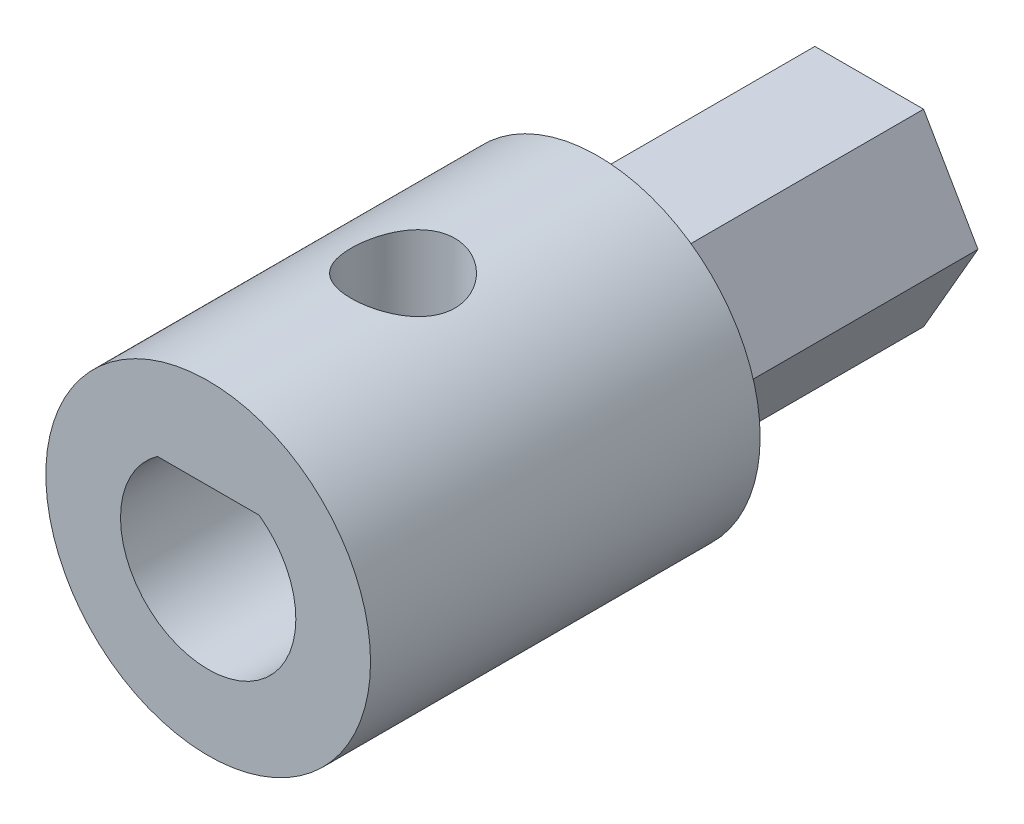
ISO-10303-21;
HEADER;
FILE_DESCRIPTION(('STEP AP214'),'2;1');
FILE_NAME('part.step','',(''),(''),'','','');
FILE_SCHEMA(('AUTOMOTIVE_DESIGN { 1 0 10303 214 1 1 1 1 }'));
ENDSEC;
DATA;
#1=APPLICATION_CONTEXT('core data for automotive mechanical design processes');
#2=APPLICATION_PROTOCOL_DEFINITION('international standard','automotive_design',2000,#1);
#3=PRODUCT_CONTEXT('',#1,'mechanical');
#4=PRODUCT('Part','Part','',(#3));
#5=PRODUCT_RELATED_PRODUCT_CATEGORY('part','',(#4));
#6=PRODUCT_DEFINITION_FORMATION('','',#4);
#7=PRODUCT_DEFINITION_CONTEXT('part definition',#1,'design');
#8=PRODUCT_DEFINITION('design','',#6,#7);
#9=PRODUCT_DEFINITION_SHAPE('','',#8);
#10=(LENGTH_UNIT() NAMED_UNIT(*) SI_UNIT(.MILLI.,.METRE.));
#11=(NAMED_UNIT(*) PLANE_ANGLE_UNIT() SI_UNIT($,.RADIAN.));
#12=(NAMED_UNIT(*) SI_UNIT($,.STERADIAN.) SOLID_ANGLE_UNIT());
#13=UNCERTAINTY_MEASURE_WITH_UNIT(LENGTH_MEASURE(1.E-05),#10,'distance_accuracy_value','');
#14=(GEOMETRIC_REPRESENTATION_CONTEXT(3) GLOBAL_UNCERTAINTY_ASSIGNED_CONTEXT((#13)) GLOBAL_UNIT_ASSIGNED_CONTEXT((#10,
#11,#12)) REPRESENTATION_CONTEXT('',''));
#15=CARTESIAN_POINT('',(0.,0.,0.));
#16=DIRECTION('',(0.,0.,1.));
#17=DIRECTION('',(1.,0.,0.));
#18=AXIS2_PLACEMENT_3D('',#15,#16,#17);
#19=CARTESIAN_POINT('',(-1.56524758424985,2.2,0.));
#20=DIRECTION('',(0.,1.,0.));
#21=DIRECTION('',(0.,0.,1.));
#22=AXIS2_PLACEMENT_3D('',#19,#20,#21);
#23=PLANE('',#22);
#24=DIRECTION('',(0.,0.,1.));
#25=VECTOR('',#24,1.);
#26=CARTESIAN_POINT('',(1.56524758424985,2.2,0.));
#27=LINE('',#26,#25);
#28=CARTESIAN_POINT('',(1.56524758424985,2.2,0.));
#29=VERTEX_POINT('',#28);
#30=CARTESIAN_POINT('',(1.56524758424985,2.2,14.0283375209644));
#31=VERTEX_POINT('',#30);
#32=EDGE_CURVE('E93',#29,#31,#27,.T.);
#33=ORIENTED_EDGE('',*,*,#32,.T.);
#34=CARTESIAN_POINT('',(0.,2.2,14.36));
#35=DIRECTION('',(0.,1.,0.));
#36=DIRECTION('',(0.,0.,1.));
#37=AXIS2_PLACEMENT_3D('',#34,#35,#36);
#38=CIRCLE('',#37,1.6);
#39=CARTESIAN_POINT('',(-1.56524758424985,2.2,14.0283375209645));
#40=VERTEX_POINT('',#39);
#41=EDGE_CURVE('E11',#31,#40,#38,.T.);
#42=ORIENTED_EDGE('',*,*,#41,.T.);
#43=DIRECTION('',(0.,0.,1.));
#44=VECTOR('',#43,1.);
#45=CARTESIAN_POINT('',(-1.56524758424985,2.2,0.));
#46=LINE('',#45,#44);
#47=CARTESIAN_POINT('',(-1.56524758424985,2.2,0.));
#48=VERTEX_POINT('',#47);
#49=EDGE_CURVE('E217',#48,#40,#46,.T.);
#50=ORIENTED_EDGE('',*,*,#49,.F.);
#51=DIRECTION('',(-1.,0.,0.));
#52=VECTOR('',#51,1.);
#53=CARTESIAN_POINT('',(-1.56524758424985,2.2,0.));
#54=LINE('',#53,#52);
#55=EDGE_CURVE('E209',#29,#48,#54,.T.);
#56=ORIENTED_EDGE('',*,*,#55,.F.);
#57=EDGE_LOOP('',(#33,#42,#50,#56));
#58=FACE_BOUND('',#57,.T.);
#59=ADVANCED_FACE('F45',(#58),#23,.F.);
#60=CARTESIAN_POINT('',(1.675,2.90118510267787,8.36));
#61=DIRECTION('',(0.,-1.,0.));
#62=DIRECTION('',(1.,0.,0.));
#63=AXIS2_PLACEMENT_3D('',#60,#61,#62);
#64=PLANE('',#63);
#65=DIRECTION('',(-1.,0.,0.));
#66=VECTOR('',#65,1.);
#67=CARTESIAN_POINT('',(1.675,2.90118510267787,0.));
#68=LINE('',#67,#66);
#69=CARTESIAN_POINT('',(1.675,2.90118510267787,0.));
#70=VERTEX_POINT('',#69);
#71=CARTESIAN_POINT('',(-1.675,2.90118510267787,0.));
#72=VERTEX_POINT('',#71);
#73=EDGE_CURVE('E149',#70,#72,#68,.T.);
#74=ORIENTED_EDGE('',*,*,#73,.T.);
#75=DIRECTION('',(0.,0.,-1.));
#76=VECTOR('',#75,1.);
#77=CARTESIAN_POINT('',(-1.675,2.90118510267787,8.36));
#78=LINE('',#77,#76);
#79=CARTESIAN_POINT('',(-1.675,2.90118510267787,8.36));
#80=VERTEX_POINT('',#79);
#81=EDGE_CURVE('E191',#80,#72,#78,.T.);
#82=ORIENTED_EDGE('',*,*,#81,.F.);
#83=DIRECTION('',(-1.,0.,0.));
#84=VECTOR('',#83,1.);
#85=CARTESIAN_POINT('',(1.675,2.90118510267787,8.36));
#86=LINE('',#85,#84);
#87=CARTESIAN_POINT('',(1.675,2.90118510267787,8.36));
#88=VERTEX_POINT('',#87);
#89=EDGE_CURVE('E144',#88,#80,#86,.T.);
#90=ORIENTED_EDGE('',*,*,#89,.F.);
#91=DIRECTION('',(0.,0.,-1.));
#92=VECTOR('',#91,1.);
#93=CARTESIAN_POINT('',(1.675,2.90118510267787,8.36));
#94=LINE('',#93,#92);
#95=EDGE_CURVE('E138',#88,#70,#94,.T.);
#96=ORIENTED_EDGE('',*,*,#95,.T.);
#97=EDGE_LOOP('',(#74,#82,#90,#96));
#98=FACE_BOUND('',#97,.T.);
#99=ADVANCED_FACE('F47',(#98),#64,.F.);
#100=CARTESIAN_POINT('',(-1.675,2.90118510267787,8.36));
#101=DIRECTION('',(0.866025403784439,-0.5,0.));
#102=DIRECTION('',(0.5,0.866025403784439,0.));
#103=AXIS2_PLACEMENT_3D('',#100,#101,#102);
#104=PLANE('',#103);
#105=DIRECTION('',(-0.5,-0.866025403784439,0.));
#106=VECTOR('',#105,1.);
#107=CARTESIAN_POINT('',(-1.675,2.90118510267787,0.));
#108=LINE('',#107,#106);
#109=CARTESIAN_POINT('',(-3.35,0.,0.));
#110=VERTEX_POINT('',#109);
#111=EDGE_CURVE('E156',#72,#110,#108,.T.);
#112=ORIENTED_EDGE('',*,*,#111,.T.);
#113=DIRECTION('',(0.,0.,-1.));
#114=VECTOR('',#113,1.);
#115=CARTESIAN_POINT('',(-3.35,0.,8.36));
#116=LINE('',#115,#114);
#117=CARTESIAN_POINT('',(-3.35,0.,8.36));
#118=VERTEX_POINT('',#117);
#119=EDGE_CURVE('E187',#118,#110,#116,.T.);
#120=ORIENTED_EDGE('',*,*,#119,.F.);
#121=DIRECTION('',(-0.5,-0.866025403784439,0.));
#122=VECTOR('',#121,1.);
#123=CARTESIAN_POINT('',(-1.675,2.90118510267787,8.36));
#124=LINE('',#123,#122);
#125=EDGE_CURVE('E225',#80,#118,#124,.T.);
#126=ORIENTED_EDGE('',*,*,#125,.F.);
#127=ORIENTED_EDGE('',*,*,#81,.T.);
#128=EDGE_LOOP('',(#112,#120,#126,#127));
#129=FACE_BOUND('',#128,.T.);
#130=ADVANCED_FACE('F245',(#129),#104,.F.);
#131=CARTESIAN_POINT('',(-3.35,0.,8.36));
#132=DIRECTION('',(0.866025403784439,0.5,0.));
#133=DIRECTION('',(-0.5,0.866025403784439,0.));
#134=AXIS2_PLACEMENT_3D('',#131,#132,#133);
#135=PLANE('',#134);
#136=DIRECTION('',(0.5,-0.866025403784439,0.));
#137=VECTOR('',#136,1.);
#138=CARTESIAN_POINT('',(-3.35,0.,0.));
#139=LINE('',#138,#137);
#140=CARTESIAN_POINT('',(-1.675,-2.90118510267787,0.));
#141=VERTEX_POINT('',#140);
#142=EDGE_CURVE('E163',#110,#141,#139,.T.);
#143=ORIENTED_EDGE('',*,*,#142,.T.);
#144=DIRECTION('',(0.,0.,-1.));
#145=VECTOR('',#144,1.);
#146=CARTESIAN_POINT('',(-1.675,-2.90118510267787,8.36));
#147=LINE('',#146,#145);
#148=CARTESIAN_POINT('',(-1.675,-2.90118510267787,8.36));
#149=VERTEX_POINT('',#148);
#150=EDGE_CURVE('E183',#149,#141,#147,.T.);
#151=ORIENTED_EDGE('',*,*,#150,.F.);
#152=DIRECTION('',(0.5,-0.866025403784439,0.));
#153=VECTOR('',#152,1.);
#154=CARTESIAN_POINT('',(-3.35,0.,8.36));
#155=LINE('',#154,#153);
#156=EDGE_CURVE('E229',#118,#149,#155,.T.);
#157=ORIENTED_EDGE('',*,*,#156,.F.);
#158=ORIENTED_EDGE('',*,*,#119,.T.);
#159=EDGE_LOOP('',(#143,#151,#157,#158));
#160=FACE_BOUND('',#159,.T.);
#161=ADVANCED_FACE('F247',(#160),#135,.F.);
#162=CARTESIAN_POINT('',(-1.675,-2.90118510267787,8.36));
#163=DIRECTION('',(0.,1.,0.));
#164=DIRECTION('',(-1.,0.,0.));
#165=AXIS2_PLACEMENT_3D('',#162,#163,#164);
#166=PLANE('',#165);
#167=DIRECTION('',(1.,0.,0.));
#168=VECTOR('',#167,1.);
#169=CARTESIAN_POINT('',(-1.675,-2.90118510267787,0.));
#170=LINE('',#169,#168);
#171=CARTESIAN_POINT('',(1.675,-2.90118510267787,0.));
#172=VERTEX_POINT('',#171);
#173=EDGE_CURVE('E173',#141,#172,#170,.T.);
#174=ORIENTED_EDGE('',*,*,#173,.T.);
#175=DIRECTION('',(0.,0.,-1.));
#176=VECTOR('',#175,1.);
#177=CARTESIAN_POINT('',(1.675,-2.90118510267787,8.36));
#178=LINE('',#177,#176);
#179=CARTESIAN_POINT('',(1.675,-2.90118510267787,8.36));
#180=VERTEX_POINT('',#179);
#181=EDGE_CURVE('E180',#180,#172,#178,.T.);
#182=ORIENTED_EDGE('',*,*,#181,.F.);
#183=DIRECTION('',(1.,0.,0.));
#184=VECTOR('',#183,1.);
#185=CARTESIAN_POINT('',(-1.675,-2.90118510267787,8.36));
#186=LINE('',#185,#184);
#187=EDGE_CURVE('E233',#149,#180,#186,.T.);
#188=ORIENTED_EDGE('',*,*,#187,.F.);
#189=ORIENTED_EDGE('',*,*,#150,.T.);
#190=EDGE_LOOP('',(#174,#182,#188,#189));
#191=FACE_BOUND('',#190,.T.);
#192=ADVANCED_FACE('F251',(#191),#166,.F.);
#193=CARTESIAN_POINT('',(1.675,-2.90118510267787,8.36));
#194=DIRECTION('',(-0.866025403784439,0.5,0.));
#195=DIRECTION('',(-0.5,-0.866025403784439,0.));
#196=AXIS2_PLACEMENT_3D('',#193,#194,#195);
#197=PLANE('',#196);
#198=DIRECTION('',(0.5,0.866025403784439,0.));
#199=VECTOR('',#198,1.);
#200=CARTESIAN_POINT('',(1.675,-2.90118510267787,0.));
#201=LINE('',#200,#199);
#202=CARTESIAN_POINT('',(3.35,0.,0.));
#203=VERTEX_POINT('',#202);
#204=EDGE_CURVE('E128',#172,#203,#201,.T.);
#205=ORIENTED_EDGE('',*,*,#204,.T.);
#206=DIRECTION('',(0.,0.,-1.));
#207=VECTOR('',#206,1.);
#208=CARTESIAN_POINT('',(3.35,0.,8.36));
#209=LINE('',#208,#207);
#210=CARTESIAN_POINT('',(3.35,0.,8.36));
#211=VERTEX_POINT('',#210);
#212=EDGE_CURVE('E140',#211,#203,#209,.T.);
#213=ORIENTED_EDGE('',*,*,#212,.F.);
#214=DIRECTION('',(0.5,0.866025403784439,0.));
#215=VECTOR('',#214,1.);
#216=CARTESIAN_POINT('',(1.675,-2.90118510267787,8.36));
#217=LINE('',#216,#215);
#218=EDGE_CURVE('E236',#180,#211,#217,.T.);
#219=ORIENTED_EDGE('',*,*,#218,.F.);
#220=ORIENTED_EDGE('',*,*,#181,.T.);
#221=EDGE_LOOP('',(#205,#213,#219,#220));
#222=FACE_BOUND('',#221,.T.);
#223=ADVANCED_FACE('F252',(#222),#197,.F.);
#224=CARTESIAN_POINT('',(3.35,0.,8.36));
#225=DIRECTION('',(-0.866025403784439,-0.5,0.));
#226=DIRECTION('',(0.5,-0.866025403784439,0.));
#227=AXIS2_PLACEMENT_3D('',#224,#225,#226);
#228=PLANE('',#227);
#229=DIRECTION('',(-0.5,0.866025403784439,0.));
#230=VECTOR('',#229,1.);
#231=CARTESIAN_POINT('',(3.35,0.,0.));
#232=LINE('',#231,#230);
#233=EDGE_CURVE('E134',#203,#70,#232,.T.);
#234=ORIENTED_EDGE('',*,*,#233,.T.);
#235=ORIENTED_EDGE('',*,*,#95,.F.);
#236=DIRECTION('',(-0.5,0.866025403784439,0.));
#237=VECTOR('',#236,1.);
#238=CARTESIAN_POINT('',(3.35,0.,8.36));
#239=LINE('',#238,#237);
#240=EDGE_CURVE('E152',#211,#88,#239,.T.);
#241=ORIENTED_EDGE('',*,*,#240,.F.);
#242=ORIENTED_EDGE('',*,*,#212,.T.);
#243=EDGE_LOOP('',(#234,#235,#241,#242));
#244=FACE_BOUND('',#243,.T.);
#245=ADVANCED_FACE('F136',(#244),#228,.F.);
#246=CARTESIAN_POINT('',(0.,0.,0.));
#247=DIRECTION('',(0.,0.,1.));
#248=DIRECTION('',(1.,0.,0.));
#249=AXIS2_PLACEMENT_3D('',#246,#247,#248);
#250=PLANE('',#249);
#251=ORIENTED_EDGE('',*,*,#55,.T.);
#252=CARTESIAN_POINT('',(0.,0.,0.));
#253=DIRECTION('',(0.,0.,1.));
#254=DIRECTION('',(1.,0.,0.));
#255=AXIS2_PLACEMENT_3D('',#252,#253,#254);
#256=CIRCLE('',#255,2.7);
#257=EDGE_CURVE('E70',#48,#29,#256,.T.);
#258=ORIENTED_EDGE('',*,*,#257,.T.);
#259=EDGE_LOOP('',(#251,#258));
#260=FACE_BOUND('',#259,.T.);
#261=ORIENTED_EDGE('',*,*,#73,.F.);
#262=ORIENTED_EDGE('',*,*,#233,.F.);
#263=ORIENTED_EDGE('',*,*,#204,.F.);
#264=ORIENTED_EDGE('',*,*,#173,.F.);
#265=ORIENTED_EDGE('',*,*,#142,.F.);
#266=ORIENTED_EDGE('',*,*,#111,.F.);
#267=EDGE_LOOP('',(#261,#262,#263,#264,#265,#266));
#268=FACE_BOUND('',#267,.T.);
#269=ADVANCED_FACE('F154',(#260,#268),#250,.F.);
#270=CARTESIAN_POINT('',(0.,0.,8.36));
#271=DIRECTION('',(0.,0.,1.));
#272=DIRECTION('',(1.,0.,0.));
#273=AXIS2_PLACEMENT_3D('',#270,#271,#272);
#274=PLANE('',#273);
#275=CARTESIAN_POINT('',(0.,0.,8.36));
#276=DIRECTION('',(0.,0.,1.));
#277=DIRECTION('',(1.,0.,0.));
#278=AXIS2_PLACEMENT_3D('',#275,#276,#277);
#279=CIRCLE('',#278,5.);
#280=CARTESIAN_POINT('',(5.,0.,8.36));
#281=VERTEX_POINT('',#280);
#282=EDGE_CURVE('E166',#281,#281,#279,.T.);
#283=ORIENTED_EDGE('',*,*,#282,.F.);
#284=EDGE_LOOP('',(#283));
#285=FACE_BOUND('',#284,.T.);
#286=ORIENTED_EDGE('',*,*,#240,.T.);
#287=ORIENTED_EDGE('',*,*,#89,.T.);
#288=ORIENTED_EDGE('',*,*,#125,.T.);
#289=ORIENTED_EDGE('',*,*,#156,.T.);
#290=ORIENTED_EDGE('',*,*,#187,.T.);
#291=ORIENTED_EDGE('',*,*,#218,.T.);
#292=EDGE_LOOP('',(#286,#287,#288,#289,#290,#291));
#293=FACE_BOUND('',#292,.T.);
#294=ADVANCED_FACE('F242',(#285,#293),#274,.F.);
#295=CARTESIAN_POINT('',(0.,0.,20.36));
#296=DIRECTION('',(0.,0.,-1.));
#297=DIRECTION('',(-1.,0.,0.));
#298=AXIS2_PLACEMENT_3D('',#295,#296,#297);
#299=CYLINDRICAL_SURFACE('',#298,5.);
#300=CARTESIAN_POINT('',(0.,-5.,15.96));
#301=CARTESIAN_POINT('',(0.0874958063159804,-4.99999978543627,15.9599997563494));
#302=CARTESIAN_POINT('',(0.174994637059061,-4.99768184156355,15.9527994047207));
#303=CARTESIAN_POINT('',(0.347426901237483,-4.98866262172227,15.9242681804707));
#304=CARTESIAN_POINT('',(0.432359863373709,-4.98196054553558,15.9029347281821));
#305=CARTESIAN_POINT('',(0.597149225791565,-4.9649038363541,15.8469350787882));
#306=CARTESIAN_POINT('',(0.677013473384595,-4.95455502045191,15.8122901076294));
#307=CARTESIAN_POINT('',(0.829798762851157,-4.93126901642872,15.7307431699127));
#308=CARTESIAN_POINT('',(0.902718607024947,-4.91833138300386,15.6838390942344));
#309=CARTESIAN_POINT('',(1.04189475779498,-4.89077067933825,15.577515886496));
#310=CARTESIAN_POINT('',(1.1078960922464,-4.87610957732918,15.5177729010466));
#311=CARTESIAN_POINT('',(1.22913423693228,-4.8469706570307,15.3881569334526));
#312=CARTESIAN_POINT('',(1.28436891793797,-4.83249287552328,15.3182819523451));
#313=CARTESIAN_POINT('',(1.38391395073831,-4.8049481079903,15.1681471454896));
#314=CARTESIAN_POINT('',(1.42790123109944,-4.79192785635417,15.0876637187295));
#315=CARTESIAN_POINT('',(1.5016091713459,-4.76934657798646,14.9199576562299));
#316=CARTESIAN_POINT('',(1.53133379773327,-4.75978458968016,14.8327369020117));
#317=CARTESIAN_POINT('',(1.57473134311321,-4.74560122760597,14.6569173927271));
#318=CARTESIAN_POINT('',(1.58887896846386,-4.74083414932744,14.568447898248));
#319=CARTESIAN_POINT('',(1.60220433058851,-4.73634831045,14.3902724008155));
#320=CARTESIAN_POINT('',(1.6013862709372,-4.73662813227306,14.300566752148));
#321=CARTESIAN_POINT('',(1.58517380736381,-4.74207619100075,14.1264344151118));
#322=CARTESIAN_POINT('',(1.57038842132725,-4.7470401743042,14.0419435465553));
#323=CARTESIAN_POINT('',(1.52765058974139,-4.76096457446162,13.8767111555779));
#324=CARTESIAN_POINT('',(1.49969668269327,-4.76992543490025,13.7959700504148));
#325=CARTESIAN_POINT('',(1.43099645158812,-4.7909865416364,13.6391021411743));
#326=CARTESIAN_POINT('',(1.39006273103723,-4.80313229469362,13.5630637800485));
#327=CARTESIAN_POINT('',(1.29669494334068,-4.82917444861168,13.4187379569732));
#328=CARTESIAN_POINT('',(1.24425776827155,-4.8430713221454,13.3504525972565));
#329=CARTESIAN_POINT('',(1.12640551540387,-4.87186372141871,13.2201353271337));
#330=CARTESIAN_POINT('',(1.06048936249403,-4.8867752080818,13.1585592230612));
#331=CARTESIAN_POINT('',(0.919081432217152,-4.91533168114877,13.0472213217663));
#332=CARTESIAN_POINT('',(0.843588875652697,-4.92897656433707,12.9974604868571));
#333=CARTESIAN_POINT('',(0.684261580712375,-4.95361789744584,12.9108365567198));
#334=CARTESIAN_POINT('',(0.600361279440636,-4.96459080547942,12.8740868991636));
#335=CARTESIAN_POINT('',(0.427135850361132,-4.98248161100196,12.8153604033373));
#336=CARTESIAN_POINT('',(0.337812463131549,-4.98940080204637,12.7933788521833));
#337=CARTESIAN_POINT('',(0.16014178958932,-4.99819424239135,12.7655999333348));
#338=CARTESIAN_POINT('',(0.0719002860170755,-5.00026060178154,12.7591859263889));
#339=CARTESIAN_POINT('',(-0.104410269588104,-4.99968655318444,12.7609792182213));
#340=CARTESIAN_POINT('',(-0.192479346087438,-4.99704687004206,12.7691842653099));
#341=CARTESIAN_POINT('',(-0.363535018203811,-4.98748380317497,12.7994901130812));
#342=CARTESIAN_POINT('',(-0.446594362478022,-4.98067486649266,12.8212199100859));
#343=CARTESIAN_POINT('',(-0.607861654600582,-4.96357585995349,12.8775017993962));
#344=CARTESIAN_POINT('',(-0.686068993794124,-4.95328535439547,12.9120554966022));
#345=CARTESIAN_POINT('',(-0.837596923870445,-4.92995531019905,12.9939710171781));
#346=CARTESIAN_POINT('',(-0.910745620500966,-4.9168532627009,13.0416325119423));
#347=CARTESIAN_POINT('',(-1.04821150300662,-4.8893940824048,13.1480538729856));
#348=CARTESIAN_POINT('',(-1.11252617555398,-4.87503659432078,13.2068168864583));
#349=CARTESIAN_POINT('',(-1.23328321488635,-4.84592967283237,13.336674159611));
#350=CARTESIAN_POINT('',(-1.2892857947562,-4.83118884166735,13.4081802676885));
#351=CARTESIAN_POINT('',(-1.38854141992569,-4.80360443110145,13.5598946744582));
#352=CARTESIAN_POINT('',(-1.43179457025642,-4.79076083607138,13.640102901454));
#353=CARTESIAN_POINT('',(-1.50407580301231,-4.76856262886575,13.8068435786561));
#354=CARTESIAN_POINT('',(-1.53315066307446,-4.75919656820051,13.8933541349897));
#355=CARTESIAN_POINT('',(-1.57620668246201,-4.74511281699328,14.0704072098103));
#356=CARTESIAN_POINT('',(-1.59019395006567,-4.74039324536734,14.160948081136));
#357=CARTESIAN_POINT('',(-1.60222535311566,-4.73633927898768,14.338875969164));
#358=CARTESIAN_POINT('',(-1.60099388446006,-4.73676019091382,14.426209011329));
#359=CARTESIAN_POINT('',(-1.5843835514937,-4.74234159093745,14.5993570054347));
#360=CARTESIAN_POINT('',(-1.56900540861121,-4.74750183734632,14.685172034561));
#361=CARTESIAN_POINT('',(-1.52503332416461,-4.76180543144416,14.8514834253769));
#362=CARTESIAN_POINT('',(-1.49665627942706,-4.77088327236763,14.9320431988929));
#363=CARTESIAN_POINT('',(-1.42766427484382,-4.79197975594362,15.0873217604008));
#364=CARTESIAN_POINT('',(-1.38704674114626,-4.8039990169992,15.1620393157627));
#365=CARTESIAN_POINT('',(-1.29279266707432,-4.83023494368376,15.3068096298144));
#366=CARTESIAN_POINT('',(-1.23869308431578,-4.8445211905268,15.376548262734));
#367=CARTESIAN_POINT('',(-1.11981399792884,-4.87337180847353,15.506191745821));
#368=CARTESIAN_POINT('',(-1.05503158166823,-4.88793625446696,15.5660939051986));
#369=CARTESIAN_POINT('',(-0.913912210298352,-4.91631108200117,15.6764582859238));
#370=CARTESIAN_POINT('',(-0.837251351760781,-4.93007751880386,15.7265189518843));
#371=CARTESIAN_POINT('',(-0.676163529926937,-4.95473787697861,15.8129801880972));
#372=CARTESIAN_POINT('',(-0.591739263208157,-4.96563279071293,15.8493854793208));
#373=CARTESIAN_POINT('',(-0.423663431644845,-4.98268341064065,15.9052477798304));
#374=CARTESIAN_POINT('',(-0.34037676648733,-4.98911901301451,15.9257184505831));
#375=CARTESIAN_POINT('',(-0.171394001076119,-4.99777693541394,15.953093142904));
#376=CARTESIAN_POINT('',(-0.0856984512613945,-5.00000021015613,15.9600002386455));
#377=CARTESIAN_POINT('',(0.,-5.,15.96));
#378=B_SPLINE_CURVE_WITH_KNOTS('',3,(#300,#301,#302,#303,#304,#305,#306,#307,#308,#309,#310,
#311,#312,#313,#314,#315,#316,#317,#318,#319,#320,#321,#322,#323,#324,#325,#326,#327,#328,#329,
#330,#331,#332,#333,#334,#335,#336,#337,#338,#339,#340,#341,#342,#343,#344,#345,#346,#347,#348,
#349,#350,#351,#352,#353,#354,#355,#356,#357,#358,#359,#360,#361,#362,#363,#364,#365,#366,#367,
#368,#369,#370,#371,#372,#373,#374,#375,#376,#377),.UNSPECIFIED.,.T.,.F.,(4,2,2,2,2,2,2,2,2,2,2,
2,2,2,2,2,2,2,2,2,2,2,2,2,2,2,2,2,2,2,2,2,2,2,2,2,2,2,4),(0.,0.262172289866487,
0.524392446348364,0.786196202111712,1.04804502964703,1.31749718151567,1.58700256668426,
1.86354828826627,2.14001705671955,2.40780489999506,2.67551752794224,2.93207089351446,
3.18865273918778,3.44912195934763,3.70966163813009,3.98267284808623,4.25570628624555,
4.53106471334195,4.80633522466349,5.07051010591344,5.33464430132699,5.59183416387789,
5.84905622438333,6.11273355055082,6.37648573964819,6.6512299305306,6.92597185797942,
7.19980110675105,7.47351945288796,7.73426134972847,7.99498995042988,8.25151822881316,
8.50810048600705,8.77513756675923,9.04224757485584,9.3186628553126,9.5949824844973,
9.85182740305348,10.1086141011962),.UNSPECIFIED.);
#379=CARTESIAN_POINT('',(0.,-5.,15.96));
#380=VERTEX_POINT('',#379);
#381=EDGE_CURVE('E323',#380,#380,#378,.T.);
#382=ORIENTED_EDGE('',*,*,#381,.T.);
#383=EDGE_LOOP('',(#382));
#384=FACE_BOUND('',#383,.T.);
#385=CARTESIAN_POINT('',(0.,5.,15.96));
#386=CARTESIAN_POINT('',(-0.0874958063159797,4.99999978543627,15.9599997563494));
#387=CARTESIAN_POINT('',(-0.174994637059061,4.99768184156355,15.9527994047207));
#388=CARTESIAN_POINT('',(-0.347426901237483,4.98866262172227,15.9242681804707));
#389=CARTESIAN_POINT('',(-0.432359863373708,4.98196054553558,15.9029347281821));
#390=CARTESIAN_POINT('',(-0.597149225791565,4.9649038363541,15.8469350787882));
#391=CARTESIAN_POINT('',(-0.677013473384594,4.95455502045191,15.8122901076294));
#392=CARTESIAN_POINT('',(-0.829798762851156,4.93126901642872,15.7307431699127));
#393=CARTESIAN_POINT('',(-0.902718607024946,4.91833138300386,15.6838390942344));
#394=CARTESIAN_POINT('',(-1.04189475779498,4.89077067933825,15.577515886496));
#395=CARTESIAN_POINT('',(-1.1078960922464,4.87610957732918,15.5177729010466));
#396=CARTESIAN_POINT('',(-1.22913423693228,4.8469706570307,15.3881569334526));
#397=CARTESIAN_POINT('',(-1.28436891793797,4.83249287552328,15.3182819523451));
#398=CARTESIAN_POINT('',(-1.38391395073831,4.8049481079903,15.1681471454896));
#399=CARTESIAN_POINT('',(-1.42790123109944,4.79192785635417,15.0876637187295));
#400=CARTESIAN_POINT('',(-1.5016091713459,4.76934657798646,14.9199576562299));
#401=CARTESIAN_POINT('',(-1.53133379773326,4.75978458968016,14.8327369020117));
#402=CARTESIAN_POINT('',(-1.57473134311321,4.74560122760597,14.6569173927271));
#403=CARTESIAN_POINT('',(-1.58887896846385,4.74083414932744,14.568447898248));
#404=CARTESIAN_POINT('',(-1.60220433058851,4.73634831045,14.3902724008155));
#405=CARTESIAN_POINT('',(-1.6013862709372,4.73662813227306,14.300566752148));
#406=CARTESIAN_POINT('',(-1.58517380736381,4.74207619100075,14.1264344151118));
#407=CARTESIAN_POINT('',(-1.57038842132725,4.7470401743042,14.0419435465553));
#408=CARTESIAN_POINT('',(-1.52765058974139,4.76096457446162,13.8767111555779));
#409=CARTESIAN_POINT('',(-1.49969668269327,4.76992543490025,13.7959700504148));
#410=CARTESIAN_POINT('',(-1.43099645158812,4.7909865416364,13.6391021411743));
#411=CARTESIAN_POINT('',(-1.39006273103722,4.80313229469363,13.5630637800485));
#412=CARTESIAN_POINT('',(-1.29669494334068,4.82917444861168,13.4187379569732));
#413=CARTESIAN_POINT('',(-1.24425776827155,4.8430713221454,13.3504525972565));
#414=CARTESIAN_POINT('',(-1.12640551540387,4.87186372141871,13.2201353271337));
#415=CARTESIAN_POINT('',(-1.06048936249402,4.8867752080818,13.1585592230612));
#416=CARTESIAN_POINT('',(-0.919081432217149,4.91533168114877,13.0472213217664));
#417=CARTESIAN_POINT('',(-0.843588875652695,4.92897656433707,12.9974604868571));
#418=CARTESIAN_POINT('',(-0.684261580712374,4.95361789744584,12.9108365567198));
#419=CARTESIAN_POINT('',(-0.600361279440635,4.96459080547942,12.8740868991636));
#420=CARTESIAN_POINT('',(-0.42713585036113,4.98248161100196,12.8153604033373));
#421=CARTESIAN_POINT('',(-0.337812463131548,4.98940080204637,12.7933788521833));
#422=CARTESIAN_POINT('',(-0.160141789589318,4.99819424239135,12.7655999333348));
#423=CARTESIAN_POINT('',(-0.0719002860170741,5.00026060178154,12.7591859263889));
#424=CARTESIAN_POINT('',(0.104410269588106,4.99968655318444,12.7609792182213));
#425=CARTESIAN_POINT('',(0.19247934608744,4.99704687004206,12.7691842653099));
#426=CARTESIAN_POINT('',(0.363535018203812,4.98748380317497,12.7994901130812));
#427=CARTESIAN_POINT('',(0.446594362478023,4.98067486649266,12.8212199100859));
#428=CARTESIAN_POINT('',(0.607861654600583,4.96357585995349,12.8775017993962));
#429=CARTESIAN_POINT('',(0.686068993794125,4.95328535439547,12.9120554966022));
#430=CARTESIAN_POINT('',(0.837596923870446,4.92995531019905,12.9939710171781));
#431=CARTESIAN_POINT('',(0.910745620500968,4.9168532627009,13.0416325119423));
#432=CARTESIAN_POINT('',(1.04821150300662,4.8893940824048,13.1480538729856));
#433=CARTESIAN_POINT('',(1.11252617555398,4.87503659432078,13.2068168864583));
#434=CARTESIAN_POINT('',(1.23328321488635,4.84592967283237,13.336674159611));
#435=CARTESIAN_POINT('',(1.2892857947562,4.83118884166735,13.4081802676885));
#436=CARTESIAN_POINT('',(1.38854141992569,4.80360443110145,13.5598946744582));
#437=CARTESIAN_POINT('',(1.43179457025642,4.79076083607138,13.640102901454));
#438=CARTESIAN_POINT('',(1.50407580301232,4.76856262886575,13.8068435786561));
#439=CARTESIAN_POINT('',(1.53315066307446,4.75919656820051,13.8933541349897));
#440=CARTESIAN_POINT('',(1.57620668246201,4.74511281699328,14.0704072098103));
#441=CARTESIAN_POINT('',(1.59019395006567,4.74039324536734,14.160948081136));
#442=CARTESIAN_POINT('',(1.60222535311566,4.73633927898768,14.338875969164));
#443=CARTESIAN_POINT('',(1.60099388446006,4.73676019091382,14.426209011329));
#444=CARTESIAN_POINT('',(1.5843835514937,4.74234159093745,14.5993570054347));
#445=CARTESIAN_POINT('',(1.56900540861121,4.74750183734632,14.685172034561));
#446=CARTESIAN_POINT('',(1.52503332416461,4.76180543144416,14.8514834253769));
#447=CARTESIAN_POINT('',(1.49665627942706,4.77088327236763,14.9320431988929));
#448=CARTESIAN_POINT('',(1.42766427484382,4.79197975594362,15.0873217604008));
#449=CARTESIAN_POINT('',(1.38704674114626,4.8039990169992,15.1620393157627));
#450=CARTESIAN_POINT('',(1.29279266707432,4.83023494368376,15.3068096298144));
#451=CARTESIAN_POINT('',(1.23869308431579,4.8445211905268,15.376548262734));
#452=CARTESIAN_POINT('',(1.11981399792885,4.87337180847353,15.506191745821));
#453=CARTESIAN_POINT('',(1.05503158166823,4.88793625446696,15.5660939051986));
#454=CARTESIAN_POINT('',(0.913912210298353,4.91631108200117,15.6764582859238));
#455=CARTESIAN_POINT('',(0.837251351760782,4.93007751880386,15.7265189518843));
#456=CARTESIAN_POINT('',(0.676163529926939,4.9547378769786,15.8129801880972));
#457=CARTESIAN_POINT('',(0.591739263208158,4.96563279071293,15.8493854793208));
#458=CARTESIAN_POINT('',(0.423663431644846,4.98268341064065,15.9052477798304));
#459=CARTESIAN_POINT('',(0.340376766487331,4.98911901301451,15.9257184505831));
#460=CARTESIAN_POINT('',(0.17139400107612,4.99777693541394,15.953093142904));
#461=CARTESIAN_POINT('',(0.0856984512613951,5.00000021015613,15.9600002386455));
#462=CARTESIAN_POINT('',(0.,5.,15.96));
#463=B_SPLINE_CURVE_WITH_KNOTS('',3,(#385,#386,#387,#388,#389,#390,#391,#392,#393,#394,#395,
#396,#397,#398,#399,#400,#401,#402,#403,#404,#405,#406,#407,#408,#409,#410,#411,#412,#413,#414,
#415,#416,#417,#418,#419,#420,#421,#422,#423,#424,#425,#426,#427,#428,#429,#430,#431,#432,#433,
#434,#435,#436,#437,#438,#439,#440,#441,#442,#443,#444,#445,#446,#447,#448,#449,#450,#451,#452,
#453,#454,#455,#456,#457,#458,#459,#460,#461,#462),.UNSPECIFIED.,.T.,.F.,(4,2,2,2,2,2,2,2,2,2,2,
2,2,2,2,2,2,2,2,2,2,2,2,2,2,2,2,2,2,2,2,2,2,2,2,2,2,2,4),(0.,0.262172289866487,
0.524392446348364,0.786196202111711,1.04804502964703,1.31749718151567,1.58700256668426,
1.86354828826627,2.14001705671955,2.40780489999507,2.67551752794223,2.93207089351446,
3.18865273918778,3.44912195934763,3.70966163813009,3.98267284808623,4.25570628624555,
4.53106471334195,4.80633522466349,5.07051010591345,5.33464430132699,5.59183416387789,
5.84905622438333,6.11273355055082,6.37648573964819,6.6512299305306,6.92597185797942,
7.19980110675105,7.47351945288796,7.73426134972847,7.99498995042988,8.25151822881316,
8.50810048600705,8.77513756675923,9.04224757485584,9.3186628553126,9.5949824844973,
9.85182740305348,10.1086141011962),.UNSPECIFIED.);
#464=CARTESIAN_POINT('',(0.,5.,15.96));
#465=VERTEX_POINT('',#464);
#466=EDGE_CURVE('E316',#465,#465,#463,.T.);
#467=ORIENTED_EDGE('',*,*,#466,.T.);
#468=EDGE_LOOP('',(#467));
#469=FACE_BOUND('',#468,.T.);
#470=CARTESIAN_POINT('',(0.,0.,20.36));
#471=DIRECTION('',(0.,0.,1.));
#472=DIRECTION('',(1.,0.,0.));
#473=AXIS2_PLACEMENT_3D('',#470,#471,#472);
#474=CIRCLE('',#473,5.);
#475=CARTESIAN_POINT('',(5.,0.,20.36));
#476=VERTEX_POINT('',#475);
#477=EDGE_CURVE('E159',#476,#476,#474,.T.);
#478=ORIENTED_EDGE('',*,*,#477,.F.);
#479=EDGE_LOOP('',(#478));
#480=FACE_BOUND('',#479,.T.);
#481=ORIENTED_EDGE('',*,*,#282,.T.);
#482=EDGE_LOOP('',(#481));
#483=FACE_BOUND('',#482,.T.);
#484=ADVANCED_FACE('F282',(#384,#469,#480,#483),#299,.T.);
#485=CARTESIAN_POINT('',(0.,0.,20.36));
#486=DIRECTION('',(0.,0.,1.));
#487=DIRECTION('',(1.,0.,0.));
#488=AXIS2_PLACEMENT_3D('',#485,#486,#487);
#489=PLANE('',#488);
#490=CARTESIAN_POINT('',(0.,0.,20.36));
#491=DIRECTION('',(0.,0.,1.));
#492=DIRECTION('',(1.,0.,0.));
#493=AXIS2_PLACEMENT_3D('',#490,#491,#492);
#494=CIRCLE('',#493,2.7);
#495=CARTESIAN_POINT('',(-1.56524758424985,2.2,20.36));
#496=VERTEX_POINT('',#495);
#497=CARTESIAN_POINT('',(1.56524758424985,2.2,20.36));
#498=VERTEX_POINT('',#497);
#499=EDGE_CURVE('E196',#496,#498,#494,.T.);
#500=ORIENTED_EDGE('',*,*,#499,.F.);
#501=DIRECTION('',(1.,0.,0.));
#502=VECTOR('',#501,1.);
#503=CARTESIAN_POINT('',(-1.56524758424985,2.2,20.36));
#504=LINE('',#503,#502);
#505=EDGE_CURVE('E194',#498,#496,#504,.F.);
#506=ORIENTED_EDGE('',*,*,#505,.F.);
#507=EDGE_LOOP('',(#500,#506));
#508=FACE_BOUND('',#507,.T.);
#509=ORIENTED_EDGE('',*,*,#477,.T.);
#510=EDGE_LOOP('',(#509));
#511=FACE_BOUND('',#510,.T.);
#512=ADVANCED_FACE('F278',(#508,#511),#489,.T.);
#513=CARTESIAN_POINT('',(0.,0.,0.));
#514=DIRECTION('',(0.,0.,1.));
#515=DIRECTION('',(1.,0.,0.));
#516=AXIS2_PLACEMENT_3D('',#513,#514,#515);
#517=CYLINDRICAL_SURFACE('',#516,2.7);
#518=CARTESIAN_POINT('',(0.,-2.7,15.96));
#519=CARTESIAN_POINT('',(-0.0820065759345022,-2.69999658267815,15.9599962422124));
#520=CARTESIAN_POINT('',(-0.164153964713905,-2.69622272848173,15.9536507503456));
#521=CARTESIAN_POINT('',(-0.325990974255463,-2.68148664448446,15.9285886587774));
#522=CARTESIAN_POINT('',(-0.405673585757345,-2.67050559211504,15.9098396646359));
#523=CARTESIAN_POINT('',(-0.559885049219612,-2.64246877845776,15.8610121320972));
#524=CARTESIAN_POINT('',(-0.634437288354856,-2.6254431132658,15.8309896822248));
#525=CARTESIAN_POINT('',(-0.777217855016616,-2.58677615989444,15.7608093622537));
#526=CARTESIAN_POINT('',(-0.845448008096425,-2.56513621012273,15.7206544305388));
#527=CARTESIAN_POINT('',(-0.979475127432626,-2.51715482048914,15.6279746551091));
#528=CARTESIAN_POINT('',(-1.04470051404402,-2.49058189021379,15.5747452990506));
#529=CARTESIAN_POINT('',(-1.16585635861109,-2.43622623895226,15.4590045439661));
#530=CARTESIAN_POINT('',(-1.22177488887931,-2.40844202222704,15.396481425268));
#531=CARTESIAN_POINT('',(-1.32946803838828,-2.35088619585746,15.2551654796481));
#532=CARTESIAN_POINT('',(-1.37995902242836,-2.32127118038344,15.1753220553933));
#533=CARTESIAN_POINT('',(-1.46660848208215,-2.26752532882853,15.0065444035038));
#534=CARTESIAN_POINT('',(-1.50278987509542,-2.24338575027536,14.9176250011729));
#535=CARTESIAN_POINT('',(-1.55231457696361,-2.20929875641411,14.7546650233182));
#536=CARTESIAN_POINT('',(-1.56903376909895,-2.19734585956121,14.6820714108413));
#537=CARTESIAN_POINT('',(-1.59220492362556,-2.18061826857276,14.5344867039612));
#538=CARTESIAN_POINT('',(-1.59866917005248,-2.17583498658958,14.4594985879117));
#539=CARTESIAN_POINT('',(-1.60096125099117,-2.17414951595484,14.3091346151449));
#540=CARTESIAN_POINT('',(-1.5967700182235,-2.17726145526209,14.2337583045585));
#541=CARTESIAN_POINT('',(-1.57797353824621,-2.19091932628889,14.0849894528251));
#542=CARTESIAN_POINT('',(-1.56336062612347,-2.20147072950346,14.0115984130602));
#543=CARTESIAN_POINT('',(-1.52468745074616,-2.22842309668515,13.8693786332758));
#544=CARTESIAN_POINT('',(-1.50072652297251,-2.24476239361386,13.8005105383989));
#545=CARTESIAN_POINT('',(-1.44422281389659,-2.28152454030498,13.6675815543537));
#546=CARTESIAN_POINT('',(-1.41167685001812,-2.30194890377046,13.6035224592759));
#547=CARTESIAN_POINT('',(-1.33250411129526,-2.34880606915806,13.4703851892025));
#548=CARTESIAN_POINT('',(-1.28442085260062,-2.37566897169547,13.4023238631517));
#549=CARTESIAN_POINT('',(-1.17842479856575,-2.42999345054902,13.2745434167388));
#550=CARTESIAN_POINT('',(-1.12050285317424,-2.4574555632237,13.2148321571183));
#551=CARTESIAN_POINT('',(-0.987338750179126,-2.51417219872305,13.0974461619415));
#552=CARTESIAN_POINT('',(-0.910818794380253,-2.54318274316712,13.0410874254415));
#553=CARTESIAN_POINT('',(-0.747626395505928,-2.5958404686453,12.9422066036778));
#554=CARTESIAN_POINT('',(-0.660959733777714,-2.61949068152911,12.899676690766));
#555=CARTESIAN_POINT('',(-0.485618800712081,-2.65738287862152,12.8327828255951));
#556=CARTESIAN_POINT('',(-0.397441525809798,-2.67213663542398,12.8074174557794));
#557=CARTESIAN_POINT('',(-0.217073540355461,-2.69278380274456,12.7721412872358));
#558=CARTESIAN_POINT('',(-0.124887531155629,-2.69868731884248,12.762212861469));
#559=CARTESIAN_POINT('',(0.0476700090999739,-2.70077374040866,12.7586963403535));
#560=CARTESIAN_POINT('',(0.127994725082622,-2.69813695390741,12.7631242297473));
#561=CARTESIAN_POINT('',(0.286549068999238,-2.68592781569133,12.7838404028183));
#562=CARTESIAN_POINT('',(0.364778716007536,-2.67635552714231,12.8001285784768));
#563=CARTESIAN_POINT('',(0.515463565598388,-2.65141845279272,12.8433188346025));
#564=CARTESIAN_POINT('',(0.588003973606519,-2.6361757285439,12.8699977752612));
#565=CARTESIAN_POINT('',(0.727580843015084,-2.60111714022657,12.9329426448649));
#566=CARTESIAN_POINT('',(0.79461615743358,-2.58130032641095,12.9692105650579));
#567=CARTESIAN_POINT('',(0.928819654179016,-2.53629851588984,13.054526956117));
#568=CARTESIAN_POINT('',(0.99527489906868,-2.5107694136459,13.1045129747787));
#569=CARTESIAN_POINT('',(1.11936320660334,-2.4579633933912,13.2137572935636));
#570=CARTESIAN_POINT('',(1.17698581934616,-2.43068445843036,13.2730264115383));
#571=CARTESIAN_POINT('',(1.28920281973577,-2.37326887305746,13.4078507824901));
#572=CARTESIAN_POINT('',(1.34250814999935,-2.34320355896362,13.4845165579631));
#573=CARTESIAN_POINT('',(1.43547441388231,-2.28743493616667,13.6471469139928));
#574=CARTESIAN_POINT('',(1.47515089947856,-2.26172667269256,13.7331007475884));
#575=CARTESIAN_POINT('',(1.53219242695774,-2.22335440380868,13.8931394120335));
#576=CARTESIAN_POINT('',(1.55252627119061,-2.2090720299705,13.9657743751017));
#577=CARTESIAN_POINT('',(1.58280505063419,-2.18748315321114,14.1141494248486));
#578=CARTESIAN_POINT('',(1.59276374615725,-2.18016741172186,14.1898852599205));
#579=CARTESIAN_POINT('',(1.60173846769329,-2.17358449161056,14.3426163375295));
#580=CARTESIAN_POINT('',(1.60071882504015,-2.17434354794437,14.4196148731673));
#581=CARTESIAN_POINT('',(1.58771651797341,-2.18385333342132,14.5721940125275));
#582=CARTESIAN_POINT('',(1.57572750701591,-2.19260868897546,14.6477737695509));
#583=CARTESIAN_POINT('',(1.54216684255452,-2.21632954479529,14.7924644335067));
#584=CARTESIAN_POINT('',(1.5209928884011,-2.23103576975973,14.861712959206));
#585=CARTESIAN_POINT('',(1.47001819505847,-2.264946070034,14.9957635035002));
#586=CARTESIAN_POINT('',(1.4402142193007,-2.28415183231536,15.060563842565));
#587=CARTESIAN_POINT('',(1.36752711003635,-2.32850732590041,15.1945936867372));
#588=CARTESIAN_POINT('',(1.32333442227277,-2.35411695460243,15.2629596784411));
#589=CARTESIAN_POINT('',(1.2253927642255,-2.40655418900442,15.39197953001));
#590=CARTESIAN_POINT('',(1.17163604814849,-2.43338276870514,15.4526270699847));
#591=CARTESIAN_POINT('',(1.04639954897449,-2.49007249458461,15.5739874278603));
#592=CARTESIAN_POINT('',(0.973466613636985,-2.51976994188955,15.6332917807028));
#593=CARTESIAN_POINT('',(0.817100566298831,-2.57472406499811,15.7388524776181));
#594=CARTESIAN_POINT('',(0.73366433923648,-2.59997941801841,15.7851049375195));
#595=CARTESIAN_POINT('',(0.56165128805617,-2.64236447038058,15.8610138232627));
#596=CARTESIAN_POINT('',(0.473396592929867,-2.65976986251062,15.8912412500028));
#597=CARTESIAN_POINT('',(0.291909898058045,-2.68572416938138,15.9358967246186));
#598=CARTESIAN_POINT('',(0.198698354386445,-2.69430690089502,15.9503851115922));
#599=CARTESIAN_POINT('',(0.0874938538840543,-2.69863962981062,15.9577029665127));
#600=CARTESIAN_POINT('',(0.0700120670624832,-2.69914892368181,15.9585634130384));
#601=CARTESIAN_POINT('',(0.0350223281895116,-2.69982947744164,15.9597123373937));
#602=CARTESIAN_POINT('',(0.0175143755674648,-2.70000072984706,15.9600008025613));
#603=CARTESIAN_POINT('',(0.,-2.7,15.96));
#604=B_SPLINE_CURVE_WITH_KNOTS('',3,(#518,#519,#520,#521,#522,#523,#524,#525,#526,#527,#528,
#529,#530,#531,#532,#533,#534,#535,#536,#537,#538,#539,#540,#541,#542,#543,#544,#545,#546,#547,
#548,#549,#550,#551,#552,#553,#554,#555,#556,#557,#558,#559,#560,#561,#562,#563,#564,#565,#566,
#567,#568,#569,#570,#571,#572,#573,#574,#575,#576,#577,#578,#579,#580,#581,#582,#583,#584,#585,
#586,#587,#588,#589,#590,#591,#592,#593,#594,#595,#596,#597,#598,#599,#600,#601,#602,#603),
.UNSPECIFIED.,.T.,.F.,(4,2,2,2,2,2,2,2,2,2,2,2,2,2,2,2,2,2,2,2,2,2,2,2,2,2,2,2,2,2,2,2,2,2,2,2,
2,2,2,2,2,2,4),(0.,0.245943988945067,0.492532863358397,0.737910805210246,0.983217669941828,
1.24702487570154,1.51116761647021,1.80672286802455,2.10180284006338,2.3271795998603,
2.55228618442905,2.77779586584491,3.00347157587968,3.22681177320268,3.45023488206726,
3.71188925448078,3.97378831322674,4.27035751297492,4.56675854968499,4.84388603635549,
5.12069684545885,5.36096692214288,5.60123481056967,5.83660469244958,6.07202348969774,
6.33195483303841,6.59219136665417,6.88510907164914,7.17769140694159,7.40703763670922,
7.63607930130573,7.86586534718178,8.09578442442366,8.3166112371023,8.53752097528368,
8.79257570318705,9.04783794509577,9.3421381117189,9.63652576830809,9.91956569164144,
10.2015166470152,10.2540424352063,10.3065693861472),.UNSPECIFIED.);
#605=CARTESIAN_POINT('',(0.,-2.7,15.96));
#606=VERTEX_POINT('',#605);
#607=EDGE_CURVE('E303',#606,#606,#604,.T.);
#608=ORIENTED_EDGE('',*,*,#607,.T.);
#609=EDGE_LOOP('',(#608));
#610=FACE_BOUND('',#609,.T.);
#611=CARTESIAN_POINT('',(1.56524758424985,2.2,14.6916624790355));
#612=VERTEX_POINT('',#611);
#613=EDGE_CURVE('E204',#612,#498,#27,.T.);
#614=ORIENTED_EDGE('',*,*,#613,.F.);
#615=CARTESIAN_POINT('',(1.56524758424985,2.2,14.6916624790356));
#616=CARTESIAN_POINT('',(1.57292963429452,2.19452808663044,14.6554381332921));
#617=CARTESIAN_POINT('',(1.57936917128531,2.18989180592703,14.6188163649431));
#618=CARTESIAN_POINT('',(1.5897018997922,2.18240605147891,14.5450175472373));
#619=CARTESIAN_POINT('',(1.59359384556162,2.17955745192049,14.5078402352998));
#620=CARTESIAN_POINT('',(1.59870735636453,2.1758085620884,14.4340011987182));
#621=CARTESIAN_POINT('',(1.5999840712512,2.17486803859762,14.3973453746061));
#622=CARTESIAN_POINT('',(1.60001562405347,2.17484482043315,14.3240511963522));
#623=CARTESIAN_POINT('',(1.59877177873663,2.17576115571661,14.287412843085));
#624=CARTESIAN_POINT('',(1.59372408946355,2.17946217006361,14.2135648301566));
#625=CARTESIAN_POINT('',(1.58986229458151,2.18228913851785,14.176361291922));
#626=CARTESIAN_POINT('',(1.57952635642709,2.18977849818965,14.102077985656));
#627=CARTESIAN_POINT('',(1.57302360387628,2.19446097604557,14.0650042084541));
#628=CARTESIAN_POINT('',(1.56524758424985,2.2,14.0283375209644));
#629=B_SPLINE_CURVE_WITH_KNOTS('',3,(#615,#616,#617,#618,#619,#620,#621,#622,#623,#624,#625,
#626,#627,#628),.UNSPECIFIED.,.F.,.F.,(4,2,2,2,2,2,4),(0.,0.112276021034319,0.224606902990104,
0.334543500973395,0.444422681710292,0.556817184440547,0.670463181993501),.UNSPECIFIED.);
#630=EDGE_CURVE('E61',#612,#31,#629,.T.);
#631=ORIENTED_EDGE('',*,*,#630,.T.);
#632=ORIENTED_EDGE('',*,*,#32,.F.);
#633=ORIENTED_EDGE('',*,*,#257,.F.);
#634=ORIENTED_EDGE('',*,*,#49,.T.);
#635=CARTESIAN_POINT('',(-1.56524758424985,2.2,14.0283375209645));
#636=CARTESIAN_POINT('',(-1.57292963429452,2.19452808663043,14.0645618667079));
#637=CARTESIAN_POINT('',(-1.57936917128531,2.18989180592703,14.1011836350569));
#638=CARTESIAN_POINT('',(-1.5897018997922,2.18240605147891,14.1749824527627));
#639=CARTESIAN_POINT('',(-1.59359384556162,2.17955745192049,14.2121597647002));
#640=CARTESIAN_POINT('',(-1.59870735636453,2.1758085620884,14.2859988012818));
#641=CARTESIAN_POINT('',(-1.5999840712512,2.17486803859762,14.3226546253939));
#642=CARTESIAN_POINT('',(-1.60001562405347,2.17484482043315,14.3959488036478));
#643=CARTESIAN_POINT('',(-1.59877177873663,2.17576115571661,14.432587156915));
#644=CARTESIAN_POINT('',(-1.59372408946355,2.17946217006362,14.5064351698434));
#645=CARTESIAN_POINT('',(-1.58986229458151,2.18228913851785,14.543638708078));
#646=CARTESIAN_POINT('',(-1.57952635642709,2.18977849818965,14.617922014344));
#647=CARTESIAN_POINT('',(-1.57302360387628,2.19446097604557,14.6549957915459));
#648=CARTESIAN_POINT('',(-1.56524758424985,2.2,14.6916624790355));
#649=B_SPLINE_CURVE_WITH_KNOTS('',3,(#635,#636,#637,#638,#639,#640,#641,#642,#643,#644,#645,
#646,#647,#648),.UNSPECIFIED.,.F.,.F.,(4,2,2,2,2,2,4),(0.,0.112276021034315,0.224606902990102,
0.334543500973394,0.44442268171029,0.556817184440528,0.670463181993465),.UNSPECIFIED.);
#650=CARTESIAN_POINT('',(-1.56524758424985,2.2,14.6916624790355));
#651=VERTEX_POINT('',#650);
#652=EDGE_CURVE('E291',#40,#651,#649,.T.);
#653=ORIENTED_EDGE('',*,*,#652,.T.);
#654=EDGE_CURVE('E85',#651,#496,#46,.T.);
#655=ORIENTED_EDGE('',*,*,#654,.T.);
#656=ORIENTED_EDGE('',*,*,#499,.T.);
#657=EDGE_LOOP('',(#614,#631,#632,#633,#634,#653,#655,#656));
#658=FACE_BOUND('',#657,.T.);
#659=ADVANCED_FACE('F207',(#610,#658),#517,.F.);
#660=ORIENTED_EDGE('',*,*,#654,.F.);
#661=EDGE_CURVE('E49',#651,#612,#38,.T.);
#662=ORIENTED_EDGE('',*,*,#661,.T.);
#663=ORIENTED_EDGE('',*,*,#613,.T.);
#664=ORIENTED_EDGE('',*,*,#505,.T.);
#665=EDGE_LOOP('',(#660,#662,#663,#664));
#666=FACE_BOUND('',#665,.T.);
#667=ADVANCED_FACE('F203',(#666),#23,.F.);
#668=CARTESIAN_POINT('',(0.,-5.,14.36));
#669=DIRECTION('',(0.,1.,0.));
#670=DIRECTION('',(0.,0.,1.));
#671=AXIS2_PLACEMENT_3D('',#668,#669,#670);
#672=CYLINDRICAL_SURFACE('',#671,1.6);
#673=ORIENTED_EDGE('',*,*,#630,.F.);
#674=ORIENTED_EDGE('',*,*,#661,.F.);
#675=ORIENTED_EDGE('',*,*,#652,.F.);
#676=ORIENTED_EDGE('',*,*,#41,.F.);
#677=EDGE_LOOP('',(#673,#674,#675,#676));
#678=FACE_BOUND('',#677,.T.);
#679=ORIENTED_EDGE('',*,*,#466,.F.);
#680=EDGE_LOOP('',(#679));
#681=FACE_BOUND('',#680,.T.);
#682=ADVANCED_FACE('F272',(#678,#681),#672,.F.);
#683=ORIENTED_EDGE('',*,*,#607,.F.);
#684=EDGE_LOOP('',(#683));
#685=FACE_BOUND('',#684,.T.);
#686=ORIENTED_EDGE('',*,*,#381,.F.);
#687=EDGE_LOOP('',(#686));
#688=FACE_BOUND('',#687,.T.);
#689=ADVANCED_FACE('F277',(#685,#688),#672,.F.);
#690=CLOSED_SHELL('',(#59,#99,#130,#161,#192,#223,#245,#269,#294,#484,#512,#659,#667,#682,#689));
#691=MANIFOLD_SOLID_BREP('B2',#690);
#692=ADVANCED_BREP_SHAPE_REPRESENTATION('',(#18,#691),#14);
#693=SHAPE_DEFINITION_REPRESENTATION(#9,#692);
ENDSEC;
END-ISO-10303-21;
